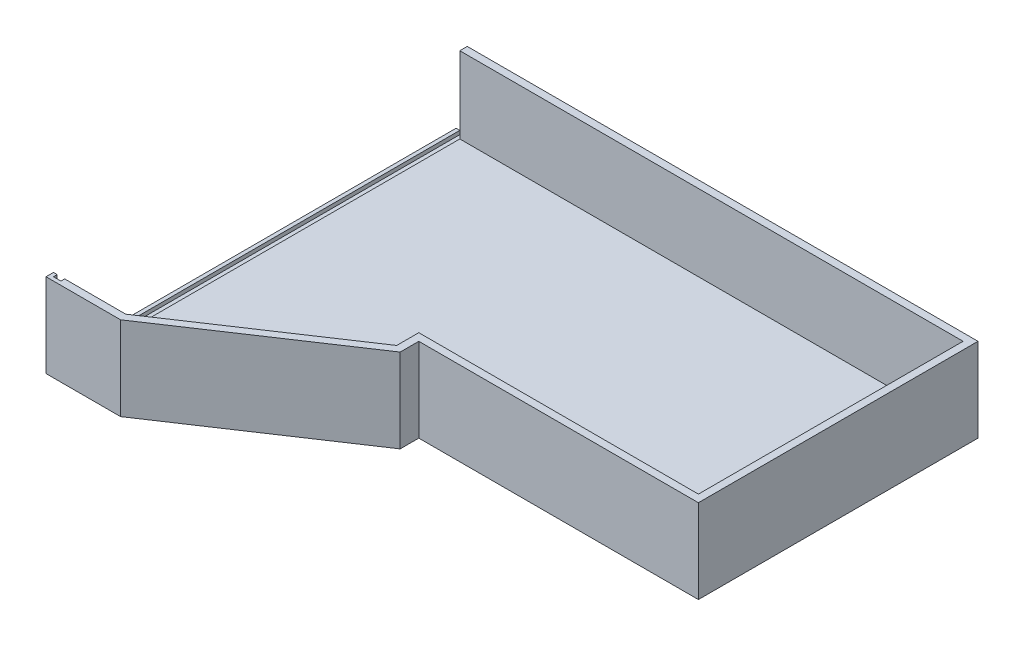
ISO-10303-21;
HEADER;
FILE_DESCRIPTION(('STEP AP214'),'2;1');
FILE_NAME('part.step','',(''),(''),'','','');
FILE_SCHEMA(('AUTOMOTIVE_DESIGN { 1 0 10303 214 1 1 1 1 }'));
ENDSEC;
DATA;
#1=APPLICATION_CONTEXT('core data for automotive mechanical design processes');
#2=APPLICATION_PROTOCOL_DEFINITION('international standard','automotive_design',2000,#1);
#3=PRODUCT_CONTEXT('',#1,'mechanical');
#4=PRODUCT('Part','Part','',(#3));
#5=PRODUCT_RELATED_PRODUCT_CATEGORY('part','',(#4));
#6=PRODUCT_DEFINITION_FORMATION('','',#4);
#7=PRODUCT_DEFINITION_CONTEXT('part definition',#1,'design');
#8=PRODUCT_DEFINITION('design','',#6,#7);
#9=PRODUCT_DEFINITION_SHAPE('','',#8);
#10=(LENGTH_UNIT() NAMED_UNIT(*) SI_UNIT(.MILLI.,.METRE.));
#11=(NAMED_UNIT(*) PLANE_ANGLE_UNIT() SI_UNIT($,.RADIAN.));
#12=(NAMED_UNIT(*) SI_UNIT($,.STERADIAN.) SOLID_ANGLE_UNIT());
#13=UNCERTAINTY_MEASURE_WITH_UNIT(LENGTH_MEASURE(1.E-05),#10,'distance_accuracy_value','');
#14=(GEOMETRIC_REPRESENTATION_CONTEXT(3) GLOBAL_UNCERTAINTY_ASSIGNED_CONTEXT((#13)) GLOBAL_UNIT_ASSIGNED_CONTEXT((#10,
#11,#12)) REPRESENTATION_CONTEXT('',''));
#15=CARTESIAN_POINT('',(0.,0.,0.));
#16=DIRECTION('',(0.,0.,1.));
#17=DIRECTION('',(1.,0.,0.));
#18=AXIS2_PLACEMENT_3D('',#15,#16,#17);
#19=CARTESIAN_POINT('',(-138.,2.,108.));
#20=DIRECTION('',(0.,0.,1.));
#21=DIRECTION('',(1.,0.,0.));
#22=AXIS2_PLACEMENT_3D('',#19,#20,#21);
#23=PLANE('',#22);
#24=DIRECTION('',(1.,0.,0.));
#25=VECTOR('',#24,1.);
#26=CARTESIAN_POINT('',(-138.,2.,108.));
#27=LINE('',#26,#25);
#28=CARTESIAN_POINT('',(-137.,2.,108.));
#29=VERTEX_POINT('',#28);
#30=CARTESIAN_POINT('',(-120.605551275464,2.,108.));
#31=VERTEX_POINT('',#30);
#32=EDGE_CURVE('E230',#29,#31,#27,.T.);
#33=ORIENTED_EDGE('',*,*,#32,.F.);
#34=DIRECTION('',(0.,-1.,0.));
#35=VECTOR('',#34,1.);
#36=CARTESIAN_POINT('',(-137.,0.999999999999998,108.));
#37=LINE('',#36,#35);
#38=CARTESIAN_POINT('',(-137.,22.5,108.));
#39=VERTEX_POINT('',#38);
#40=EDGE_CURVE('E284',#39,#29,#37,.T.);
#41=ORIENTED_EDGE('',*,*,#40,.F.);
#42=DIRECTION('',(1.,0.,0.));
#43=VECTOR('',#42,1.);
#44=CARTESIAN_POINT('',(-138.,22.5,108.));
#45=LINE('',#44,#43);
#46=CARTESIAN_POINT('',(-120.605551275464,22.5,108.));
#47=VERTEX_POINT('',#46);
#48=EDGE_CURVE('E213',#39,#47,#45,.T.);
#49=ORIENTED_EDGE('',*,*,#48,.T.);
#50=DIRECTION('',(0.,1.,0.));
#51=VECTOR('',#50,1.);
#52=CARTESIAN_POINT('',(-120.605551275464,2.,108.));
#53=LINE('',#52,#51);
#54=EDGE_CURVE('E153',#31,#47,#53,.T.);
#55=ORIENTED_EDGE('',*,*,#54,.F.);
#56=EDGE_LOOP('',(#33,#41,#49,#55));
#57=FACE_BOUND('',#56,.T.);
#58=ADVANCED_FACE('F43',(#57),#23,.F.);
#59=CARTESIAN_POINT('',(0.,2.,0.));
#60=DIRECTION('',(0.,1.,0.));
#61=DIRECTION('',(0.,0.,1.));
#62=AXIS2_PLACEMENT_3D('',#59,#60,#61);
#63=PLANE('',#62);
#64=DIRECTION('',(0.,0.,-1.));
#65=VECTOR('',#64,1.);
#66=CARTESIAN_POINT('',(-137.,2.,0.));
#67=LINE('',#66,#65);
#68=CARTESIAN_POINT('',(-137.,2.,2.));
#69=VERTEX_POINT('',#68);
#70=EDGE_CURVE('E264',#29,#69,#67,.T.);
#71=ORIENTED_EDGE('',*,*,#70,.F.);
#72=ORIENTED_EDGE('',*,*,#32,.T.);
#73=DIRECTION('',(0.832050294337844,0.,-0.554700196225229));
#74=VECTOR('',#73,1.);
#75=CARTESIAN_POINT('',(-120.605551275464,2.,108.));
#76=LINE('',#75,#74);
#77=CARTESIAN_POINT('',(-77.,2.,78.929632483024));
#78=VERTEX_POINT('',#77);
#79=EDGE_CURVE('E212',#31,#78,#76,.T.);
#80=ORIENTED_EDGE('',*,*,#79,.T.);
#81=DIRECTION('',(0.,0.,-1.));
#82=VECTOR('',#81,1.);
#83=CARTESIAN_POINT('',(-77.,2.,78.929632483024));
#84=LINE('',#83,#82);
#85=CARTESIAN_POINT('',(-77.,2.,73.));
#86=VERTEX_POINT('',#85);
#87=EDGE_CURVE('E240',#78,#86,#84,.T.);
#88=ORIENTED_EDGE('',*,*,#87,.T.);
#89=DIRECTION('',(1.,0.,0.));
#90=VECTOR('',#89,1.);
#91=CARTESIAN_POINT('',(-77.,2.,73.));
#92=LINE('',#91,#90);
#93=CARTESIAN_POINT('',(-2.,2.,73.));
#94=VERTEX_POINT('',#93);
#95=EDGE_CURVE('E237',#86,#94,#92,.T.);
#96=ORIENTED_EDGE('',*,*,#95,.T.);
#97=DIRECTION('',(0.,0.,-1.));
#98=VECTOR('',#97,1.);
#99=CARTESIAN_POINT('',(-2.,2.,73.));
#100=LINE('',#99,#98);
#101=CARTESIAN_POINT('',(-2.,2.,2.));
#102=VERTEX_POINT('',#101);
#103=EDGE_CURVE('E234',#94,#102,#100,.T.);
#104=ORIENTED_EDGE('',*,*,#103,.T.);
#105=DIRECTION('',(-1.,0.,0.));
#106=VECTOR('',#105,1.);
#107=CARTESIAN_POINT('',(-2.,2.,2.));
#108=LINE('',#107,#106);
#109=EDGE_CURVE('E231',#102,#69,#108,.T.);
#110=ORIENTED_EDGE('',*,*,#109,.T.);
#111=EDGE_LOOP('',(#71,#72,#80,#88,#96,#104,#110));
#112=FACE_BOUND('',#111,.T.);
#113=ADVANCED_FACE('F377',(#112),#63,.T.);
#114=CARTESIAN_POINT('',(-75.,22.5,80.));
#115=DIRECTION('',(-1.,0.,0.));
#116=DIRECTION('',(0.,0.,1.));
#117=AXIS2_PLACEMENT_3D('',#114,#115,#116);
#118=PLANE('',#117);
#119=DIRECTION('',(0.,0.,-1.));
#120=VECTOR('',#119,1.);
#121=CARTESIAN_POINT('',(-75.,0.,80.));
#122=LINE('',#121,#120);
#123=CARTESIAN_POINT('',(-75.,0.,80.));
#124=VERTEX_POINT('',#123);
#125=CARTESIAN_POINT('',(-75.,0.,75.));
#126=VERTEX_POINT('',#125);
#127=EDGE_CURVE('E149',#124,#126,#122,.T.);
#128=ORIENTED_EDGE('',*,*,#127,.T.);
#129=DIRECTION('',(0.,-1.,0.));
#130=VECTOR('',#129,1.);
#131=CARTESIAN_POINT('',(-75.,22.5,75.));
#132=LINE('',#131,#130);
#133=CARTESIAN_POINT('',(-75.,22.5,75.));
#134=VERTEX_POINT('',#133);
#135=EDGE_CURVE('E11',#134,#126,#132,.T.);
#136=ORIENTED_EDGE('',*,*,#135,.F.);
#137=DIRECTION('',(0.,0.,-1.));
#138=VECTOR('',#137,1.);
#139=CARTESIAN_POINT('',(-75.,22.5,80.));
#140=LINE('',#139,#138);
#141=CARTESIAN_POINT('',(-75.,22.5,80.));
#142=VERTEX_POINT('',#141);
#143=EDGE_CURVE('E164',#142,#134,#140,.T.);
#144=ORIENTED_EDGE('',*,*,#143,.F.);
#145=DIRECTION('',(0.,-1.,0.));
#146=VECTOR('',#145,1.);
#147=CARTESIAN_POINT('',(-75.,22.5,80.));
#148=LINE('',#147,#146);
#149=EDGE_CURVE('E145',#142,#124,#148,.T.);
#150=ORIENTED_EDGE('',*,*,#149,.T.);
#151=EDGE_LOOP('',(#128,#136,#144,#150));
#152=FACE_BOUND('',#151,.T.);
#153=ADVANCED_FACE('F45',(#152),#118,.F.);
#154=CARTESIAN_POINT('',(-75.,22.5,75.));
#155=DIRECTION('',(0.,0.,-1.));
#156=DIRECTION('',(-1.,0.,0.));
#157=AXIS2_PLACEMENT_3D('',#154,#155,#156);
#158=PLANE('',#157);
#159=DIRECTION('',(1.,0.,0.));
#160=VECTOR('',#159,1.);
#161=CARTESIAN_POINT('',(-75.,0.,75.));
#162=LINE('',#161,#160);
#163=CARTESIAN_POINT('',(0.,0.,75.));
#164=VERTEX_POINT('',#163);
#165=EDGE_CURVE('E152',#126,#164,#162,.T.);
#166=ORIENTED_EDGE('',*,*,#165,.T.);
#167=DIRECTION('',(0.,-1.,0.));
#168=VECTOR('',#167,1.);
#169=CARTESIAN_POINT('',(0.,22.5,75.));
#170=LINE('',#169,#168);
#171=CARTESIAN_POINT('',(0.,22.5,75.));
#172=VERTEX_POINT('',#171);
#173=EDGE_CURVE('E51',#172,#164,#170,.T.);
#174=ORIENTED_EDGE('',*,*,#173,.F.);
#175=DIRECTION('',(1.,0.,0.));
#176=VECTOR('',#175,1.);
#177=CARTESIAN_POINT('',(-75.,22.5,75.));
#178=LINE('',#177,#176);
#179=EDGE_CURVE('E105',#134,#172,#178,.T.);
#180=ORIENTED_EDGE('',*,*,#179,.F.);
#181=ORIENTED_EDGE('',*,*,#135,.T.);
#182=EDGE_LOOP('',(#166,#174,#180,#181));
#183=FACE_BOUND('',#182,.T.);
#184=ADVANCED_FACE('F413',(#183),#158,.F.);
#185=CARTESIAN_POINT('',(0.,22.5,75.));
#186=DIRECTION('',(-1.,0.,0.));
#187=DIRECTION('',(0.,0.,1.));
#188=AXIS2_PLACEMENT_3D('',#185,#186,#187);
#189=PLANE('',#188);
#190=DIRECTION('',(0.,0.,-1.));
#191=VECTOR('',#190,1.);
#192=CARTESIAN_POINT('',(0.,0.,75.));
#193=LINE('',#192,#191);
#194=CARTESIAN_POINT('',(0.,0.,0.));
#195=VERTEX_POINT('',#194);
#196=EDGE_CURVE('E155',#164,#195,#193,.T.);
#197=ORIENTED_EDGE('',*,*,#196,.T.);
#198=DIRECTION('',(0.,-1.,0.));
#199=VECTOR('',#198,1.);
#200=CARTESIAN_POINT('',(0.,22.5,0.));
#201=LINE('',#200,#199);
#202=CARTESIAN_POINT('',(0.,22.5,0.));
#203=VERTEX_POINT('',#202);
#204=EDGE_CURVE('E168',#203,#195,#201,.T.);
#205=ORIENTED_EDGE('',*,*,#204,.F.);
#206=DIRECTION('',(0.,0.,-1.));
#207=VECTOR('',#206,1.);
#208=CARTESIAN_POINT('',(0.,22.5,75.));
#209=LINE('',#208,#207);
#210=EDGE_CURVE('E176',#172,#203,#209,.T.);
#211=ORIENTED_EDGE('',*,*,#210,.F.);
#212=ORIENTED_EDGE('',*,*,#173,.T.);
#213=EDGE_LOOP('',(#197,#205,#211,#212));
#214=FACE_BOUND('',#213,.T.);
#215=ADVANCED_FACE('F174',(#214),#189,.F.);
#216=CARTESIAN_POINT('',(0.,22.5,0.));
#217=DIRECTION('',(0.,0.,1.));
#218=DIRECTION('',(1.,0.,0.));
#219=AXIS2_PLACEMENT_3D('',#216,#217,#218);
#220=PLANE('',#219);
#221=DIRECTION('',(-1.,0.,0.));
#222=VECTOR('',#221,1.);
#223=CARTESIAN_POINT('',(-137.,0.999999999999998,0.));
#224=LINE('',#223,#222);
#225=CARTESIAN_POINT('',(-137.,0.999999999999998,0.));
#226=VERTEX_POINT('',#225);
#227=CARTESIAN_POINT('',(-139.,0.999999999999998,0.));
#228=VERTEX_POINT('',#227);
#229=EDGE_CURVE('E270',#226,#228,#224,.T.);
#230=ORIENTED_EDGE('',*,*,#229,.F.);
#231=DIRECTION('',(0.,1.,0.));
#232=VECTOR('',#231,1.);
#233=CARTESIAN_POINT('',(-137.,22.5,0.));
#234=LINE('',#233,#232);
#235=CARTESIAN_POINT('',(-137.,22.5,0.));
#236=VERTEX_POINT('',#235);
#237=EDGE_CURVE('E192',#226,#236,#234,.T.);
#238=ORIENTED_EDGE('',*,*,#237,.T.);
#239=DIRECTION('',(-1.,0.,0.));
#240=VECTOR('',#239,1.);
#241=CARTESIAN_POINT('',(0.,22.5,0.));
#242=LINE('',#241,#240);
#243=EDGE_CURVE('E130',#203,#236,#242,.T.);
#244=ORIENTED_EDGE('',*,*,#243,.F.);
#245=ORIENTED_EDGE('',*,*,#204,.T.);
#246=DIRECTION('',(-1.,0.,0.));
#247=VECTOR('',#246,1.);
#248=CARTESIAN_POINT('',(0.,0.,0.));
#249=LINE('',#248,#247);
#250=CARTESIAN_POINT('',(-140.,0.,0.));
#251=VERTEX_POINT('',#250);
#252=EDGE_CURVE('E157',#195,#251,#249,.T.);
#253=ORIENTED_EDGE('',*,*,#252,.T.);
#254=DIRECTION('',(0.,-1.,0.));
#255=VECTOR('',#254,1.);
#256=CARTESIAN_POINT('',(-140.,22.5,0.));
#257=LINE('',#256,#255);
#258=CARTESIAN_POINT('',(-140.,2.,0.));
#259=VERTEX_POINT('',#258);
#260=EDGE_CURVE('E140',#259,#251,#257,.T.);
#261=ORIENTED_EDGE('',*,*,#260,.F.);
#262=DIRECTION('',(1.,0.,0.));
#263=VECTOR('',#262,1.);
#264=CARTESIAN_POINT('',(0.,2.,0.));
#265=LINE('',#264,#263);
#266=CARTESIAN_POINT('',(-139.,2.,0.));
#267=VERTEX_POINT('',#266);
#268=EDGE_CURVE('E249',#259,#267,#265,.T.);
#269=ORIENTED_EDGE('',*,*,#268,.T.);
#270=DIRECTION('',(0.,1.,0.));
#271=VECTOR('',#270,1.);
#272=CARTESIAN_POINT('',(-139.,0.999999999999998,0.));
#273=LINE('',#272,#271);
#274=EDGE_CURVE('E256',#228,#267,#273,.T.);
#275=ORIENTED_EDGE('',*,*,#274,.F.);
#276=EDGE_LOOP('',(#230,#238,#244,#245,#253,#261,#269,#275));
#277=FACE_BOUND('',#276,.T.);
#278=ADVANCED_FACE('F184',(#277),#220,.F.);
#279=CARTESIAN_POINT('',(-140.,22.5,0.));
#280=DIRECTION('',(1.,0.,0.));
#281=DIRECTION('',(0.,0.,-1.));
#282=AXIS2_PLACEMENT_3D('',#279,#280,#281);
#283=PLANE('',#282);
#284=DIRECTION('',(0.,0.,-1.));
#285=VECTOR('',#284,1.);
#286=CARTESIAN_POINT('',(-140.,2.,0.));
#287=LINE('',#286,#285);
#288=CARTESIAN_POINT('',(-140.,2.,108.));
#289=VERTEX_POINT('',#288);
#290=EDGE_CURVE('E246',#289,#259,#287,.T.);
#291=ORIENTED_EDGE('',*,*,#290,.T.);
#292=ORIENTED_EDGE('',*,*,#260,.T.);
#293=DIRECTION('',(0.,0.,1.));
#294=VECTOR('',#293,1.);
#295=CARTESIAN_POINT('',(-140.,0.,0.));
#296=LINE('',#295,#294);
#297=CARTESIAN_POINT('',(-140.,0.,110.));
#298=VERTEX_POINT('',#297);
#299=EDGE_CURVE('E137',#251,#298,#296,.T.);
#300=ORIENTED_EDGE('',*,*,#299,.T.);
#301=DIRECTION('',(0.,-1.,0.));
#302=VECTOR('',#301,1.);
#303=CARTESIAN_POINT('',(-140.,22.5,110.));
#304=LINE('',#303,#302);
#305=CARTESIAN_POINT('',(-140.,22.5,110.));
#306=VERTEX_POINT('',#305);
#307=EDGE_CURVE('E133',#306,#298,#304,.T.);
#308=ORIENTED_EDGE('',*,*,#307,.F.);
#309=DIRECTION('',(0.,0.,1.));
#310=VECTOR('',#309,1.);
#311=CARTESIAN_POINT('',(-140.,22.5,0.));
#312=LINE('',#311,#310);
#313=CARTESIAN_POINT('',(-140.,22.5,108.));
#314=VERTEX_POINT('',#313);
#315=EDGE_CURVE('E116',#314,#306,#312,.T.);
#316=ORIENTED_EDGE('',*,*,#315,.F.);
#317=DIRECTION('',(0.,-1.,0.));
#318=VECTOR('',#317,1.);
#319=CARTESIAN_POINT('',(-140.,22.5,108.));
#320=LINE('',#319,#318);
#321=EDGE_CURVE('E227',#314,#289,#320,.T.);
#322=ORIENTED_EDGE('',*,*,#321,.T.);
#323=EDGE_LOOP('',(#291,#292,#300,#308,#316,#322));
#324=FACE_BOUND('',#323,.T.);
#325=ADVANCED_FACE('F135',(#324),#283,.F.);
#326=CARTESIAN_POINT('',(-140.,22.5,110.));
#327=DIRECTION('',(0.,0.,-1.));
#328=DIRECTION('',(-1.,0.,0.));
#329=AXIS2_PLACEMENT_3D('',#326,#327,#328);
#330=PLANE('',#329);
#331=DIRECTION('',(1.,0.,0.));
#332=VECTOR('',#331,1.);
#333=CARTESIAN_POINT('',(-140.,0.,110.));
#334=LINE('',#333,#332);
#335=CARTESIAN_POINT('',(-120.,0.,110.));
#336=VERTEX_POINT('',#335);
#337=EDGE_CURVE('E161',#298,#336,#334,.T.);
#338=ORIENTED_EDGE('',*,*,#337,.T.);
#339=DIRECTION('',(0.,-1.,0.));
#340=VECTOR('',#339,1.);
#341=CARTESIAN_POINT('',(-120.,22.5,110.));
#342=LINE('',#341,#340);
#343=CARTESIAN_POINT('',(-120.,22.5,110.));
#344=VERTEX_POINT('',#343);
#345=EDGE_CURVE('E141',#344,#336,#342,.T.);
#346=ORIENTED_EDGE('',*,*,#345,.F.);
#347=DIRECTION('',(1.,0.,0.));
#348=VECTOR('',#347,1.);
#349=CARTESIAN_POINT('',(-140.,22.5,110.));
#350=LINE('',#349,#348);
#351=EDGE_CURVE('E121',#306,#344,#350,.T.);
#352=ORIENTED_EDGE('',*,*,#351,.F.);
#353=ORIENTED_EDGE('',*,*,#307,.T.);
#354=EDGE_LOOP('',(#338,#346,#352,#353));
#355=FACE_BOUND('',#354,.T.);
#356=ADVANCED_FACE('F143',(#355),#330,.F.);
#357=CARTESIAN_POINT('',(-120.,22.5,110.));
#358=DIRECTION('',(-0.554700196225229,0.,-0.832050294337843));
#359=DIRECTION('',(-0.832050294337844,0.,0.554700196225229));
#360=AXIS2_PLACEMENT_3D('',#357,#358,#359);
#361=PLANE('',#360);
#362=DIRECTION('',(0.832050294337844,0.,-0.554700196225229));
#363=VECTOR('',#362,1.);
#364=CARTESIAN_POINT('',(-120.,0.,110.));
#365=LINE('',#364,#363);
#366=EDGE_CURVE('E97',#336,#124,#365,.T.);
#367=ORIENTED_EDGE('',*,*,#366,.T.);
#368=ORIENTED_EDGE('',*,*,#149,.F.);
#369=DIRECTION('',(0.832050294337844,0.,-0.554700196225229));
#370=VECTOR('',#369,1.);
#371=CARTESIAN_POINT('',(-120.,22.5,110.));
#372=LINE('',#371,#370);
#373=EDGE_CURVE('E67',#344,#142,#372,.T.);
#374=ORIENTED_EDGE('',*,*,#373,.F.);
#375=ORIENTED_EDGE('',*,*,#345,.T.);
#376=EDGE_LOOP('',(#367,#368,#374,#375));
#377=FACE_BOUND('',#376,.T.);
#378=ADVANCED_FACE('F431',(#377),#361,.F.);
#379=CARTESIAN_POINT('',(0.,22.5,0.));
#380=DIRECTION('',(0.,-1.,0.));
#381=DIRECTION('',(0.,0.,-1.));
#382=AXIS2_PLACEMENT_3D('',#379,#380,#381);
#383=PLANE('',#382);
#384=ORIENTED_EDGE('',*,*,#48,.F.);
#385=DIRECTION('',(0.,0.,-1.));
#386=VECTOR('',#385,1.);
#387=CARTESIAN_POINT('',(-137.,22.5,109.));
#388=LINE('',#387,#386);
#389=CARTESIAN_POINT('',(-137.,22.5,109.));
#390=VERTEX_POINT('',#389);
#391=EDGE_CURVE('E267',#390,#39,#388,.T.);
#392=ORIENTED_EDGE('',*,*,#391,.F.);
#393=DIRECTION('',(1.,0.,0.));
#394=VECTOR('',#393,1.);
#395=CARTESIAN_POINT('',(-137.,22.5,109.));
#396=LINE('',#395,#394);
#397=CARTESIAN_POINT('',(-139.,22.5,109.));
#398=VERTEX_POINT('',#397);
#399=EDGE_CURVE('E277',#398,#390,#396,.T.);
#400=ORIENTED_EDGE('',*,*,#399,.F.);
#401=DIRECTION('',(0.,0.,-1.));
#402=VECTOR('',#401,1.);
#403=CARTESIAN_POINT('',(-139.,22.5,109.));
#404=LINE('',#403,#402);
#405=CARTESIAN_POINT('',(-139.,22.5,108.));
#406=VERTEX_POINT('',#405);
#407=EDGE_CURVE('E275',#398,#406,#404,.T.);
#408=ORIENTED_EDGE('',*,*,#407,.T.);
#409=EDGE_CURVE('E126',#314,#406,#45,.T.);
#410=ORIENTED_EDGE('',*,*,#409,.F.);
#411=ORIENTED_EDGE('',*,*,#315,.T.);
#412=ORIENTED_EDGE('',*,*,#351,.T.);
#413=ORIENTED_EDGE('',*,*,#373,.T.);
#414=ORIENTED_EDGE('',*,*,#143,.T.);
#415=ORIENTED_EDGE('',*,*,#179,.T.);
#416=ORIENTED_EDGE('',*,*,#210,.T.);
#417=ORIENTED_EDGE('',*,*,#243,.T.);
#418=DIRECTION('',(0.,0.,1.));
#419=VECTOR('',#418,1.);
#420=CARTESIAN_POINT('',(-137.,22.5,-18.5));
#421=LINE('',#420,#419);
#422=CARTESIAN_POINT('',(-137.,22.5,2.));
#423=VERTEX_POINT('',#422);
#424=EDGE_CURVE('E251',#236,#423,#421,.T.);
#425=ORIENTED_EDGE('',*,*,#424,.T.);
#426=DIRECTION('',(-1.,0.,0.));
#427=VECTOR('',#426,1.);
#428=CARTESIAN_POINT('',(-2.,22.5,2.));
#429=LINE('',#428,#427);
#430=CARTESIAN_POINT('',(-2.,22.5,2.));
#431=VERTEX_POINT('',#430);
#432=EDGE_CURVE('E214',#431,#423,#429,.T.);
#433=ORIENTED_EDGE('',*,*,#432,.F.);
#434=DIRECTION('',(0.,0.,-1.));
#435=VECTOR('',#434,1.);
#436=CARTESIAN_POINT('',(-2.,22.5,73.));
#437=LINE('',#436,#435);
#438=CARTESIAN_POINT('',(-2.,22.5,73.));
#439=VERTEX_POINT('',#438);
#440=EDGE_CURVE('E217',#439,#431,#437,.T.);
#441=ORIENTED_EDGE('',*,*,#440,.F.);
#442=DIRECTION('',(1.,0.,0.));
#443=VECTOR('',#442,1.);
#444=CARTESIAN_POINT('',(-77.,22.5,73.));
#445=LINE('',#444,#443);
#446=CARTESIAN_POINT('',(-77.,22.5,73.));
#447=VERTEX_POINT('',#446);
#448=EDGE_CURVE('E220',#447,#439,#445,.T.);
#449=ORIENTED_EDGE('',*,*,#448,.F.);
#450=DIRECTION('',(0.,0.,-1.));
#451=VECTOR('',#450,1.);
#452=CARTESIAN_POINT('',(-77.,22.5,78.929632483024));
#453=LINE('',#452,#451);
#454=CARTESIAN_POINT('',(-77.,22.5,78.929632483024));
#455=VERTEX_POINT('',#454);
#456=EDGE_CURVE('E223',#455,#447,#453,.T.);
#457=ORIENTED_EDGE('',*,*,#456,.F.);
#458=DIRECTION('',(0.832050294337844,0.,-0.554700196225229));
#459=VECTOR('',#458,1.);
#460=CARTESIAN_POINT('',(-120.605551275464,22.5,108.));
#461=LINE('',#460,#459);
#462=EDGE_CURVE('E58',#47,#455,#461,.T.);
#463=ORIENTED_EDGE('',*,*,#462,.F.);
#464=EDGE_LOOP('',(#384,#392,#400,#408,#410,#411,#412,#413,#414,#415,#416,#417,#425,#433,#441,
#449,#457,#463));
#465=FACE_BOUND('',#464,.T.);
#466=ADVANCED_FACE('F119',(#465),#383,.F.);
#467=CARTESIAN_POINT('',(0.,0.,0.));
#468=DIRECTION('',(0.,-1.,0.));
#469=DIRECTION('',(0.,0.,-1.));
#470=AXIS2_PLACEMENT_3D('',#467,#468,#469);
#471=PLANE('',#470);
#472=ORIENTED_EDGE('',*,*,#127,.F.);
#473=ORIENTED_EDGE('',*,*,#366,.F.);
#474=ORIENTED_EDGE('',*,*,#337,.F.);
#475=ORIENTED_EDGE('',*,*,#299,.F.);
#476=ORIENTED_EDGE('',*,*,#252,.F.);
#477=ORIENTED_EDGE('',*,*,#196,.F.);
#478=ORIENTED_EDGE('',*,*,#165,.F.);
#479=EDGE_LOOP('',(#472,#473,#474,#475,#476,#477,#478));
#480=FACE_BOUND('',#479,.T.);
#481=ADVANCED_FACE('F180',(#480),#471,.T.);
#482=CARTESIAN_POINT('',(-120.605551275464,2.,108.));
#483=DIRECTION('',(0.554700196225229,0.,0.832050294337844));
#484=DIRECTION('',(0.832050294337844,0.,-0.554700196225229));
#485=AXIS2_PLACEMENT_3D('',#482,#483,#484);
#486=PLANE('',#485);
#487=ORIENTED_EDGE('',*,*,#462,.T.);
#488=DIRECTION('',(0.,1.,0.));
#489=VECTOR('',#488,1.);
#490=CARTESIAN_POINT('',(-77.,2.,78.929632483024));
#491=LINE('',#490,#489);
#492=EDGE_CURVE('E198',#78,#455,#491,.T.);
#493=ORIENTED_EDGE('',*,*,#492,.F.);
#494=ORIENTED_EDGE('',*,*,#79,.F.);
#495=ORIENTED_EDGE('',*,*,#54,.T.);
#496=EDGE_LOOP('',(#487,#493,#494,#495));
#497=FACE_BOUND('',#496,.T.);
#498=ADVANCED_FACE('F367',(#497),#486,.F.);
#499=ORIENTED_EDGE('',*,*,#409,.T.);
#500=DIRECTION('',(0.,1.,0.));
#501=VECTOR('',#500,1.);
#502=CARTESIAN_POINT('',(-139.,0.999999999999998,108.));
#503=LINE('',#502,#501);
#504=CARTESIAN_POINT('',(-139.,2.,108.));
#505=VERTEX_POINT('',#504);
#506=EDGE_CURVE('E280',#505,#406,#503,.T.);
#507=ORIENTED_EDGE('',*,*,#506,.F.);
#508=EDGE_CURVE('E201',#289,#505,#27,.T.);
#509=ORIENTED_EDGE('',*,*,#508,.F.);
#510=ORIENTED_EDGE('',*,*,#321,.F.);
#511=EDGE_LOOP('',(#499,#507,#509,#510));
#512=FACE_BOUND('',#511,.T.);
#513=ADVANCED_FACE('F393',(#512),#23,.F.);
#514=CARTESIAN_POINT('',(-2.,2.,2.));
#515=DIRECTION('',(0.,0.,-1.));
#516=DIRECTION('',(-1.,0.,0.));
#517=AXIS2_PLACEMENT_3D('',#514,#515,#516);
#518=PLANE('',#517);
#519=ORIENTED_EDGE('',*,*,#432,.T.);
#520=DIRECTION('',(0.,1.,0.));
#521=VECTOR('',#520,1.);
#522=CARTESIAN_POINT('',(-137.,22.5,2.));
#523=LINE('',#522,#521);
#524=EDGE_CURVE('E253',#69,#423,#523,.T.);
#525=ORIENTED_EDGE('',*,*,#524,.F.);
#526=ORIENTED_EDGE('',*,*,#109,.F.);
#527=DIRECTION('',(0.,1.,0.));
#528=VECTOR('',#527,1.);
#529=CARTESIAN_POINT('',(-2.,2.,2.));
#530=LINE('',#529,#528);
#531=EDGE_CURVE('E207',#102,#431,#530,.T.);
#532=ORIENTED_EDGE('',*,*,#531,.T.);
#533=EDGE_LOOP('',(#519,#525,#526,#532));
#534=FACE_BOUND('',#533,.T.);
#535=ADVANCED_FACE('F379',(#534),#518,.F.);
#536=CARTESIAN_POINT('',(-2.,2.,73.));
#537=DIRECTION('',(1.,0.,0.));
#538=DIRECTION('',(0.,0.,-1.));
#539=AXIS2_PLACEMENT_3D('',#536,#537,#538);
#540=PLANE('',#539);
#541=ORIENTED_EDGE('',*,*,#440,.T.);
#542=ORIENTED_EDGE('',*,*,#531,.F.);
#543=ORIENTED_EDGE('',*,*,#103,.F.);
#544=DIRECTION('',(0.,1.,0.));
#545=VECTOR('',#544,1.);
#546=CARTESIAN_POINT('',(-2.,2.,73.));
#547=LINE('',#546,#545);
#548=EDGE_CURVE('E204',#94,#439,#547,.T.);
#549=ORIENTED_EDGE('',*,*,#548,.T.);
#550=EDGE_LOOP('',(#541,#542,#543,#549));
#551=FACE_BOUND('',#550,.T.);
#552=ADVANCED_FACE('F401',(#551),#540,.F.);
#553=CARTESIAN_POINT('',(-77.,2.,73.));
#554=DIRECTION('',(0.,0.,1.));
#555=DIRECTION('',(1.,0.,0.));
#556=AXIS2_PLACEMENT_3D('',#553,#554,#555);
#557=PLANE('',#556);
#558=ORIENTED_EDGE('',*,*,#448,.T.);
#559=ORIENTED_EDGE('',*,*,#548,.F.);
#560=ORIENTED_EDGE('',*,*,#95,.F.);
#561=DIRECTION('',(0.,1.,0.));
#562=VECTOR('',#561,1.);
#563=CARTESIAN_POINT('',(-77.,2.,73.));
#564=LINE('',#563,#562);
#565=EDGE_CURVE('E200',#86,#447,#564,.T.);
#566=ORIENTED_EDGE('',*,*,#565,.T.);
#567=EDGE_LOOP('',(#558,#559,#560,#566));
#568=FACE_BOUND('',#567,.T.);
#569=ADVANCED_FACE('F420',(#568),#557,.F.);
#570=CARTESIAN_POINT('',(-77.,2.,78.929632483024));
#571=DIRECTION('',(1.,0.,0.));
#572=DIRECTION('',(0.,0.,-1.));
#573=AXIS2_PLACEMENT_3D('',#570,#571,#572);
#574=PLANE('',#573);
#575=ORIENTED_EDGE('',*,*,#456,.T.);
#576=ORIENTED_EDGE('',*,*,#565,.F.);
#577=ORIENTED_EDGE('',*,*,#87,.F.);
#578=ORIENTED_EDGE('',*,*,#492,.T.);
#579=EDGE_LOOP('',(#575,#576,#577,#578));
#580=FACE_BOUND('',#579,.T.);
#581=ADVANCED_FACE('F372',(#580),#574,.F.);
#582=DIRECTION('',(0.,0.,1.));
#583=VECTOR('',#582,1.);
#584=CARTESIAN_POINT('',(-139.,2.,0.));
#585=LINE('',#584,#583);
#586=EDGE_CURVE('E260',#267,#505,#585,.T.);
#587=ORIENTED_EDGE('',*,*,#586,.F.);
#588=ORIENTED_EDGE('',*,*,#268,.F.);
#589=ORIENTED_EDGE('',*,*,#290,.F.);
#590=ORIENTED_EDGE('',*,*,#508,.T.);
#591=EDGE_LOOP('',(#587,#588,#589,#590));
#592=FACE_BOUND('',#591,.T.);
#593=ADVANCED_FACE('F390',(#592),#63,.T.);
#594=CARTESIAN_POINT('',(-137.,22.5,-18.5));
#595=DIRECTION('',(1.,0.,0.));
#596=DIRECTION('',(0.,0.,-1.));
#597=AXIS2_PLACEMENT_3D('',#594,#595,#596);
#598=PLANE('',#597);
#599=ORIENTED_EDGE('',*,*,#237,.F.);
#600=DIRECTION('',(0.,0.,-1.));
#601=VECTOR('',#600,1.);
#602=CARTESIAN_POINT('',(-137.,0.999999999999998,0.));
#603=LINE('',#602,#601);
#604=CARTESIAN_POINT('',(-137.,0.999999999999998,109.));
#605=VERTEX_POINT('',#604);
#606=EDGE_CURVE('E263',#605,#226,#603,.T.);
#607=ORIENTED_EDGE('',*,*,#606,.F.);
#608=DIRECTION('',(0.,-1.,0.));
#609=VECTOR('',#608,1.);
#610=CARTESIAN_POINT('',(-137.,0.999999999999998,109.));
#611=LINE('',#610,#609);
#612=EDGE_CURVE('E283',#390,#605,#611,.T.);
#613=ORIENTED_EDGE('',*,*,#612,.F.);
#614=ORIENTED_EDGE('',*,*,#391,.T.);
#615=ORIENTED_EDGE('',*,*,#40,.T.);
#616=ORIENTED_EDGE('',*,*,#70,.T.);
#617=ORIENTED_EDGE('',*,*,#524,.T.);
#618=ORIENTED_EDGE('',*,*,#424,.F.);
#619=EDGE_LOOP('',(#599,#607,#613,#614,#615,#616,#617,#618));
#620=FACE_BOUND('',#619,.T.);
#621=ADVANCED_FACE('F309',(#620),#598,.F.);
#622=CARTESIAN_POINT('',(-139.,0.999999999999998,0.));
#623=DIRECTION('',(-1.,0.,0.));
#624=DIRECTION('',(0.,0.,1.));
#625=AXIS2_PLACEMENT_3D('',#622,#623,#624);
#626=PLANE('',#625);
#627=ORIENTED_EDGE('',*,*,#586,.T.);
#628=ORIENTED_EDGE('',*,*,#506,.T.);
#629=ORIENTED_EDGE('',*,*,#407,.F.);
#630=DIRECTION('',(0.,1.,0.));
#631=VECTOR('',#630,1.);
#632=CARTESIAN_POINT('',(-139.,0.999999999999998,109.));
#633=LINE('',#632,#631);
#634=CARTESIAN_POINT('',(-139.,0.999999999999998,109.));
#635=VERTEX_POINT('',#634);
#636=EDGE_CURVE('E289',#635,#398,#633,.T.);
#637=ORIENTED_EDGE('',*,*,#636,.F.);
#638=DIRECTION('',(0.,0.,1.));
#639=VECTOR('',#638,1.);
#640=CARTESIAN_POINT('',(-139.,0.999999999999998,0.));
#641=LINE('',#640,#639);
#642=EDGE_CURVE('E259',#228,#635,#641,.T.);
#643=ORIENTED_EDGE('',*,*,#642,.F.);
#644=ORIENTED_EDGE('',*,*,#274,.T.);
#645=EDGE_LOOP('',(#627,#628,#629,#637,#643,#644));
#646=FACE_BOUND('',#645,.T.);
#647=ADVANCED_FACE('F387',(#646),#626,.F.);
#648=CARTESIAN_POINT('',(0.,0.999999999999998,0.));
#649=DIRECTION('',(0.,-1.,0.));
#650=DIRECTION('',(0.,0.,-1.));
#651=AXIS2_PLACEMENT_3D('',#648,#649,#650);
#652=PLANE('',#651);
#653=ORIENTED_EDGE('',*,*,#606,.T.);
#654=ORIENTED_EDGE('',*,*,#229,.T.);
#655=ORIENTED_EDGE('',*,*,#642,.T.);
#656=DIRECTION('',(-1.,0.,0.));
#657=VECTOR('',#656,1.);
#658=CARTESIAN_POINT('',(-137.,0.999999999999998,109.));
#659=LINE('',#658,#657);
#660=EDGE_CURVE('E292',#605,#635,#659,.T.);
#661=ORIENTED_EDGE('',*,*,#660,.F.);
#662=EDGE_LOOP('',(#653,#654,#655,#661));
#663=FACE_BOUND('',#662,.T.);
#664=ADVANCED_FACE('F382',(#663),#652,.F.);
#665=CARTESIAN_POINT('',(0.,0.,109.));
#666=DIRECTION('',(0.,0.,1.));
#667=DIRECTION('',(1.,0.,0.));
#668=AXIS2_PLACEMENT_3D('',#665,#666,#667);
#669=PLANE('',#668);
#670=ORIENTED_EDGE('',*,*,#612,.T.);
#671=ORIENTED_EDGE('',*,*,#660,.T.);
#672=ORIENTED_EDGE('',*,*,#636,.T.);
#673=ORIENTED_EDGE('',*,*,#399,.T.);
#674=EDGE_LOOP('',(#670,#671,#672,#673));
#675=FACE_BOUND('',#674,.T.);
#676=ADVANCED_FACE('F299',(#675),#669,.F.);
#677=CLOSED_SHELL('',(#58,#113,#153,#184,#215,#278,#325,#356,#378,#466,#481,#498,#513,#535,#552,
#569,#581,#593,#621,#647,#664,#676));
#678=MANIFOLD_SOLID_BREP('B2',#677);
#679=ADVANCED_BREP_SHAPE_REPRESENTATION('',(#18,#678),#14);
#680=SHAPE_DEFINITION_REPRESENTATION(#9,#679);
ENDSEC;
END-ISO-10303-21;
